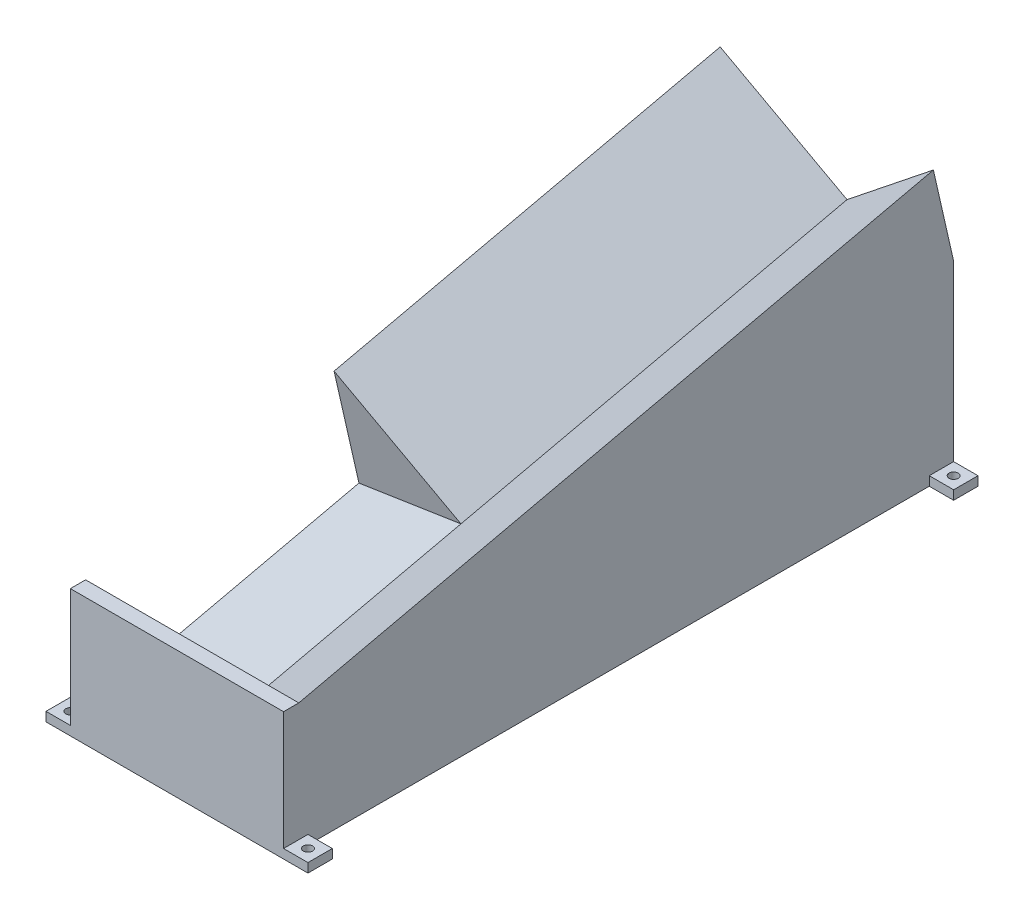
ISO-10303-21;
HEADER;
FILE_DESCRIPTION(('STEP AP214'),'2;1');
FILE_NAME('part.step','',(''),(''),'','','');
FILE_SCHEMA(('AUTOMOTIVE_DESIGN { 1 0 10303 214 1 1 1 1 }'));
ENDSEC;
DATA;
#1=APPLICATION_CONTEXT('core data for automotive mechanical design processes');
#2=APPLICATION_PROTOCOL_DEFINITION('international standard','automotive_design',2000,#1);
#3=PRODUCT_CONTEXT('',#1,'mechanical');
#4=PRODUCT('Part','Part','',(#3));
#5=PRODUCT_RELATED_PRODUCT_CATEGORY('part','',(#4));
#6=PRODUCT_DEFINITION_FORMATION('','',#4);
#7=PRODUCT_DEFINITION_CONTEXT('part definition',#1,'design');
#8=PRODUCT_DEFINITION('design','',#6,#7);
#9=PRODUCT_DEFINITION_SHAPE('','',#8);
#10=(LENGTH_UNIT() NAMED_UNIT(*) SI_UNIT(.MILLI.,.METRE.));
#11=(NAMED_UNIT(*) PLANE_ANGLE_UNIT() SI_UNIT($,.RADIAN.));
#12=(NAMED_UNIT(*) SI_UNIT($,.STERADIAN.) SOLID_ANGLE_UNIT());
#13=UNCERTAINTY_MEASURE_WITH_UNIT(LENGTH_MEASURE(1.E-05),#10,'distance_accuracy_value','');
#14=(GEOMETRIC_REPRESENTATION_CONTEXT(3) GLOBAL_UNCERTAINTY_ASSIGNED_CONTEXT((#13)) GLOBAL_UNIT_ASSIGNED_CONTEXT((#10,
#11,#12)) REPRESENTATION_CONTEXT('',''));
#15=CARTESIAN_POINT('',(0.,0.,0.));
#16=DIRECTION('',(0.,0.,1.));
#17=DIRECTION('',(1.,0.,0.));
#18=AXIS2_PLACEMENT_3D('',#15,#16,#17);
#19=CARTESIAN_POINT('',(70.,0.,0.));
#20=DIRECTION('',(1.,0.,0.));
#21=DIRECTION('',(0.,0.,-1.));
#22=AXIS2_PLACEMENT_3D('',#19,#20,#21);
#23=PLANE('',#22);
#24=DIRECTION('',(0.,1.,0.));
#25=VECTOR('',#24,1.);
#26=CARTESIAN_POINT('',(70.,0.,0.));
#27=LINE('',#26,#25);
#28=CARTESIAN_POINT('',(70.,3.,0.));
#29=VERTEX_POINT('',#28);
#30=CARTESIAN_POINT('',(70.,41.9014022891231,0.));
#31=VERTEX_POINT('',#30);
#32=EDGE_CURVE('E448',#29,#31,#27,.T.);
#33=ORIENTED_EDGE('',*,*,#32,.F.);
#34=DIRECTION('',(0.,0.,1.));
#35=VECTOR('',#34,1.);
#36=CARTESIAN_POINT('',(70.,3.,-8.));
#37=LINE('',#36,#35);
#38=CARTESIAN_POINT('',(70.,3.,-8.));
#39=VERTEX_POINT('',#38);
#40=EDGE_CURVE('E246',#39,#29,#37,.T.);
#41=ORIENTED_EDGE('',*,*,#40,.F.);
#42=DIRECTION('',(0.,-1.,0.));
#43=VECTOR('',#42,1.);
#44=CARTESIAN_POINT('',(70.,3.,-8.));
#45=LINE('',#44,#43);
#46=CARTESIAN_POINT('',(70.,0.,-8.));
#47=VERTEX_POINT('',#46);
#48=EDGE_CURVE('E227',#39,#47,#45,.T.);
#49=ORIENTED_EDGE('',*,*,#48,.T.);
#50=DIRECTION('',(0.,0.,-1.));
#51=VECTOR('',#50,1.);
#52=CARTESIAN_POINT('',(70.,0.,0.));
#53=LINE('',#52,#51);
#54=CARTESIAN_POINT('',(70.,0.,-212.));
#55=VERTEX_POINT('',#54);
#56=EDGE_CURVE('E452',#47,#55,#53,.T.);
#57=ORIENTED_EDGE('',*,*,#56,.T.);
#58=DIRECTION('',(0.,-1.,0.));
#59=VECTOR('',#58,1.);
#60=CARTESIAN_POINT('',(70.,3.,-212.));
#61=LINE('',#60,#59);
#62=CARTESIAN_POINT('',(70.,3.,-212.));
#63=VERTEX_POINT('',#62);
#64=EDGE_CURVE('E296',#63,#55,#61,.T.);
#65=ORIENTED_EDGE('',*,*,#64,.F.);
#66=DIRECTION('',(0.,0.,1.));
#67=VECTOR('',#66,1.);
#68=CARTESIAN_POINT('',(70.,3.,-220.));
#69=LINE('',#68,#67);
#70=CARTESIAN_POINT('',(70.,3.,-220.));
#71=VERTEX_POINT('',#70);
#72=EDGE_CURVE('E316',#71,#63,#69,.T.);
#73=ORIENTED_EDGE('',*,*,#72,.F.);
#74=DIRECTION('',(0.,1.,0.));
#75=VECTOR('',#74,1.);
#76=CARTESIAN_POINT('',(70.,0.,-220.));
#77=LINE('',#76,#75);
#78=CARTESIAN_POINT('',(70.,60.,-220.));
#79=VERTEX_POINT('',#78);
#80=EDGE_CURVE('E445',#71,#79,#77,.T.);
#81=ORIENTED_EDGE('',*,*,#80,.T.);
#82=DIRECTION('',(0.,0.97513285579146,0.221621103588968));
#83=VECTOR('',#82,1.);
#84=CARTESIAN_POINT('',(70.,50.4911591355599,-222.161100196464));
#85=LINE('',#84,#83);
#86=CARTESIAN_POINT('',(70.,89.2539856737438,-213.351366892331));
#87=VERTEX_POINT('',#86);
#88=EDGE_CURVE('E420',#79,#87,#85,.T.);
#89=ORIENTED_EDGE('',*,*,#88,.T.);
#90=DIRECTION('',(0.,0.221621103588968,-0.97513285579146));
#91=VECTOR('',#90,1.);
#92=CARTESIAN_POINT('',(70.,60.443242207178,-86.5840956394413));
#93=LINE('',#92,#91);
#94=CARTESIAN_POINT('',(70.,41.9014022891231,-5.00000000000002));
#95=VERTEX_POINT('',#94);
#96=EDGE_CURVE('E438',#95,#87,#93,.T.);
#97=ORIENTED_EDGE('',*,*,#96,.F.);
#98=DIRECTION('',(0.,0.,-1.));
#99=VECTOR('',#98,1.);
#100=CARTESIAN_POINT('',(70.,41.9014022891231,0.));
#101=LINE('',#100,#99);
#102=EDGE_CURVE('E379',#31,#95,#101,.T.);
#103=ORIENTED_EDGE('',*,*,#102,.F.);
#104=EDGE_LOOP('',(#33,#41,#49,#57,#65,#73,#81,#89,#97,#103));
#105=FACE_BOUND('',#104,.T.);
#106=ADVANCED_FACE('F63',(#105),#23,.T.);
#107=CARTESIAN_POINT('',(0.,0.,0.));
#108=DIRECTION('',(1.,0.,0.));
#109=DIRECTION('',(0.,0.,-1.));
#110=AXIS2_PLACEMENT_3D('',#107,#108,#109);
#111=PLANE('',#110);
#112=DIRECTION('',(0.,0.,-1.));
#113=VECTOR('',#112,1.);
#114=CARTESIAN_POINT('',(0.,3.,-7.99999999999999));
#115=LINE('',#114,#113);
#116=CARTESIAN_POINT('',(0.,3.,0.));
#117=VERTEX_POINT('',#116);
#118=CARTESIAN_POINT('',(0.,3.,-7.99999999999999));
#119=VERTEX_POINT('',#118);
#120=EDGE_CURVE('E270',#117,#119,#115,.T.);
#121=ORIENTED_EDGE('',*,*,#120,.F.);
#122=DIRECTION('',(0.,1.,0.));
#123=VECTOR('',#122,1.);
#124=CARTESIAN_POINT('',(0.,0.,0.));
#125=LINE('',#124,#123);
#126=CARTESIAN_POINT('',(0.,41.9014022891231,0.));
#127=VERTEX_POINT('',#126);
#128=EDGE_CURVE('E457',#117,#127,#125,.T.);
#129=ORIENTED_EDGE('',*,*,#128,.T.);
#130=DIRECTION('',(0.,0.,-1.));
#131=VECTOR('',#130,1.);
#132=CARTESIAN_POINT('',(0.,41.9014022891231,0.));
#133=LINE('',#132,#131);
#134=CARTESIAN_POINT('',(0.,41.9014022891231,-5.));
#135=VERTEX_POINT('',#134);
#136=EDGE_CURVE('E374',#127,#135,#133,.T.);
#137=ORIENTED_EDGE('',*,*,#136,.T.);
#138=DIRECTION('',(0.,-1.,0.));
#139=VECTOR('',#138,1.);
#140=CARTESIAN_POINT('',(0.,0.,-5.));
#141=LINE('',#140,#139);
#142=CARTESIAN_POINT('',(-3.53883589099269E-13,4.13636363636196,-5.0000000000004));
#143=VERTEX_POINT('',#142);
#144=EDGE_CURVE('E375',#135,#143,#141,.T.);
#145=ORIENTED_EDGE('',*,*,#144,.T.);
#146=DIRECTION('',(0.,-0.221621103588968,0.97513285579146));
#147=VECTOR('',#146,1.);
#148=CARTESIAN_POINT('',(0.,32.271514553641,-128.794664036036));
#149=LINE('',#148,#147);
#150=CARTESIAN_POINT('',(0.,24.5330679283227,-94.7454988846357));
#151=VERTEX_POINT('',#150);
#152=EDGE_CURVE('E396',#151,#143,#149,.T.);
#153=ORIENTED_EDGE('',*,*,#152,.F.);
#154=DIRECTION('',(0.,-0.97513285579146,-0.221621103588968));
#155=VECTOR('',#154,1.);
#156=CARTESIAN_POINT('',(0.,21.6804156689941,-95.393828943574));
#157=LINE('',#156,#155);
#158=CARTESIAN_POINT('',(0.,60.443242207178,-86.5840956394413));
#159=VERTEX_POINT('',#158);
#160=EDGE_CURVE('E421',#159,#151,#157,.T.);
#161=ORIENTED_EDGE('',*,*,#160,.F.);
#162=DIRECTION('',(0.,0.221621103588968,-0.97513285579146));
#163=VECTOR('',#162,1.);
#164=CARTESIAN_POINT('',(0.,60.443242207178,-86.5840956394413));
#165=LINE('',#164,#163);
#166=CARTESIAN_POINT('',(0.,89.2539856737438,-213.351366892331));
#167=VERTEX_POINT('',#166);
#168=EDGE_CURVE('E407',#159,#167,#165,.T.);
#169=ORIENTED_EDGE('',*,*,#168,.T.);
#170=DIRECTION('',(0.,-0.97513285579146,-0.221621103588968));
#171=VECTOR('',#170,1.);
#172=CARTESIAN_POINT('',(0.,50.4911591355599,-222.161100196464));
#173=LINE('',#172,#171);
#174=CARTESIAN_POINT('',(0.,60.,-220.));
#175=VERTEX_POINT('',#174);
#176=EDGE_CURVE('E412',#167,#175,#173,.T.);
#177=ORIENTED_EDGE('',*,*,#176,.T.);
#178=DIRECTION('',(0.,1.,0.));
#179=VECTOR('',#178,1.);
#180=CARTESIAN_POINT('',(0.,0.,-220.));
#181=LINE('',#180,#179);
#182=CARTESIAN_POINT('',(0.,3.,-220.));
#183=VERTEX_POINT('',#182);
#184=EDGE_CURVE('E441',#183,#175,#181,.T.);
#185=ORIENTED_EDGE('',*,*,#184,.F.);
#186=DIRECTION('',(0.,0.,-1.));
#187=VECTOR('',#186,1.);
#188=CARTESIAN_POINT('',(0.,3.,-220.));
#189=LINE('',#188,#187);
#190=CARTESIAN_POINT('',(0.,3.,-212.));
#191=VERTEX_POINT('',#190);
#192=EDGE_CURVE('E343',#191,#183,#189,.T.);
#193=ORIENTED_EDGE('',*,*,#192,.F.);
#194=DIRECTION('',(0.,-1.,0.));
#195=VECTOR('',#194,1.);
#196=CARTESIAN_POINT('',(0.,3.,-212.));
#197=LINE('',#196,#195);
#198=CARTESIAN_POINT('',(0.,0.,-212.));
#199=VERTEX_POINT('',#198);
#200=EDGE_CURVE('E357',#191,#199,#197,.T.);
#201=ORIENTED_EDGE('',*,*,#200,.T.);
#202=DIRECTION('',(0.,0.,-1.));
#203=VECTOR('',#202,1.);
#204=CARTESIAN_POINT('',(0.,0.,0.));
#205=LINE('',#204,#203);
#206=CARTESIAN_POINT('',(0.,0.,-7.99999999999999));
#207=VERTEX_POINT('',#206);
#208=EDGE_CURVE('E449',#207,#199,#205,.T.);
#209=ORIENTED_EDGE('',*,*,#208,.F.);
#210=DIRECTION('',(0.,-1.,0.));
#211=VECTOR('',#210,1.);
#212=CARTESIAN_POINT('',(0.,3.,-7.99999999999999));
#213=LINE('',#212,#211);
#214=EDGE_CURVE('E87',#119,#207,#213,.T.);
#215=ORIENTED_EDGE('',*,*,#214,.F.);
#216=EDGE_LOOP('',(#121,#129,#137,#145,#153,#161,#169,#177,#185,#193,#201,#209,#215));
#217=FACE_BOUND('',#216,.T.);
#218=ADVANCED_FACE('F485',(#217),#111,.F.);
#219=CARTESIAN_POINT('',(10.0052258890304,10.2979204259837,-97.9807596806218));
#220=DIRECTION('',(0.650791373455968,-0.740376058942992,-0.168267286123407));
#221=DIRECTION('',(0.751085481533816,0.660204967740409,0.));
#222=AXIS2_PLACEMENT_3D('',#219,#220,#221);
#223=PLANE('',#222);
#224=DIRECTION('',(0.,0.221621103588968,-0.97513285579146));
#225=VECTOR('',#224,1.);
#226=CARTESIAN_POINT('',(35.,10.1352516924822,-0.59510744692165));
#227=LINE('',#226,#225);
#228=CARTESIAN_POINT('',(35.,11.1363636363638,-5.00000000000001));
#229=VERTEX_POINT('',#228);
#230=CARTESIAN_POINT('',(35.,31.1892565334342,-93.2327287471104));
#231=VERTEX_POINT('',#230);
#232=EDGE_CURVE('E401',#229,#231,#227,.T.);
#233=ORIENTED_EDGE('',*,*,#232,.F.);
#234=DIRECTION('',(0.751085481533816,0.66020496774041,0.));
#235=VECTOR('',#234,1.);
#236=CARTESIAN_POINT('',(20.4839539216836,-1.62325689748328,-5.));
#237=LINE('',#236,#235);
#238=EDGE_CURVE('E393',#229,#95,#237,.T.);
#239=ORIENTED_EDGE('',*,*,#238,.T.);
#240=ORIENTED_EDGE('',*,*,#96,.T.);
#241=DIRECTION('',(-0.759256602365297,-0.634608050522565,-0.144229102391492));
#242=VECTOR('',#241,1.);
#243=CARTESIAN_POINT('',(10.0052258890304,39.1086638925496,-224.748030933512));
#244=LINE('',#243,#242);
#245=CARTESIAN_POINT('',(35.,60.,-220.));
#246=VERTEX_POINT('',#245);
#247=EDGE_CURVE('E433',#87,#246,#244,.T.);
#248=ORIENTED_EDGE('',*,*,#247,.T.);
#249=DIRECTION('',(0.,0.221621103588968,-0.97513285579146));
#250=VECTOR('',#249,1.);
#251=CARTESIAN_POINT('',(35.,31.1892565334342,-93.2327287471104));
#252=LINE('',#251,#250);
#253=EDGE_CURVE('E437',#231,#246,#252,.T.);
#254=ORIENTED_EDGE('',*,*,#253,.F.);
#255=EDGE_LOOP('',(#233,#239,#240,#248,#254));
#256=FACE_BOUND('',#255,.T.);
#257=ADVANCED_FACE('F494',(#256),#223,.F.);
#258=CARTESIAN_POINT('',(70.,0.,-220.));
#259=DIRECTION('',(0.,0.,1.));
#260=DIRECTION('',(1.,0.,0.));
#261=AXIS2_PLACEMENT_3D('',#258,#259,#260);
#262=PLANE('',#261);
#263=DIRECTION('',(-1.,0.,0.));
#264=VECTOR('',#263,1.);
#265=CARTESIAN_POINT('',(70.,0.,-220.));
#266=LINE('',#265,#264);
#267=CARTESIAN_POINT('',(78.,0.,-220.));
#268=VERTEX_POINT('',#267);
#269=CARTESIAN_POINT('',(-8.,0.,-220.));
#270=VERTEX_POINT('',#269);
#271=EDGE_CURVE('E217',#268,#270,#266,.T.);
#272=ORIENTED_EDGE('',*,*,#271,.T.);
#273=DIRECTION('',(0.,-1.,0.));
#274=VECTOR('',#273,1.);
#275=CARTESIAN_POINT('',(-8.,3.,-220.));
#276=LINE('',#275,#274);
#277=CARTESIAN_POINT('',(-8.,3.,-220.));
#278=VERTEX_POINT('',#277);
#279=EDGE_CURVE('E370',#278,#270,#276,.T.);
#280=ORIENTED_EDGE('',*,*,#279,.F.);
#281=DIRECTION('',(-1.,0.,0.));
#282=VECTOR('',#281,1.);
#283=CARTESIAN_POINT('',(0.,3.,-220.));
#284=LINE('',#283,#282);
#285=EDGE_CURVE('E347',#183,#278,#284,.T.);
#286=ORIENTED_EDGE('',*,*,#285,.F.);
#287=ORIENTED_EDGE('',*,*,#184,.T.);
#288=DIRECTION('',(-1.,0.,0.));
#289=VECTOR('',#288,1.);
#290=CARTESIAN_POINT('',(0.,60.,-220.));
#291=LINE('',#290,#289);
#292=EDGE_CURVE('E416',#246,#175,#291,.T.);
#293=ORIENTED_EDGE('',*,*,#292,.F.);
#294=DIRECTION('',(-1.,0.,0.));
#295=VECTOR('',#294,1.);
#296=CARTESIAN_POINT('',(70.,60.,-220.));
#297=LINE('',#296,#295);
#298=EDGE_CURVE('E72',#79,#246,#297,.T.);
#299=ORIENTED_EDGE('',*,*,#298,.F.);
#300=ORIENTED_EDGE('',*,*,#80,.F.);
#301=DIRECTION('',(-1.,0.,0.));
#302=VECTOR('',#301,1.);
#303=CARTESIAN_POINT('',(78.,3.,-220.));
#304=LINE('',#303,#302);
#305=CARTESIAN_POINT('',(78.,3.,-220.));
#306=VERTEX_POINT('',#305);
#307=EDGE_CURVE('E320',#306,#71,#304,.T.);
#308=ORIENTED_EDGE('',*,*,#307,.F.);
#309=DIRECTION('',(0.,-1.,0.));
#310=VECTOR('',#309,1.);
#311=CARTESIAN_POINT('',(78.,3.,-220.));
#312=LINE('',#311,#310);
#313=EDGE_CURVE('E289',#306,#268,#312,.T.);
#314=ORIENTED_EDGE('',*,*,#313,.T.);
#315=EDGE_LOOP('',(#272,#280,#286,#287,#293,#299,#300,#308,#314));
#316=FACE_BOUND('',#315,.T.);
#317=ADVANCED_FACE('F65',(#316),#262,.F.);
#318=CARTESIAN_POINT('',(70.,0.,0.));
#319=DIRECTION('',(0.,0.,1.));
#320=DIRECTION('',(1.,0.,0.));
#321=AXIS2_PLACEMENT_3D('',#318,#319,#320);
#322=PLANE('',#321);
#323=DIRECTION('',(-1.,0.,0.));
#324=VECTOR('',#323,1.);
#325=CARTESIAN_POINT('',(70.,0.,0.));
#326=LINE('',#325,#324);
#327=CARTESIAN_POINT('',(78.,0.,0.));
#328=VERTEX_POINT('',#327);
#329=CARTESIAN_POINT('',(-8.,0.,0.));
#330=VERTEX_POINT('',#329);
#331=EDGE_CURVE('E204',#328,#330,#326,.T.);
#332=ORIENTED_EDGE('',*,*,#331,.F.);
#333=DIRECTION('',(0.,-1.,0.));
#334=VECTOR('',#333,1.);
#335=CARTESIAN_POINT('',(78.,3.,0.));
#336=LINE('',#335,#334);
#337=CARTESIAN_POINT('',(78.,3.,0.));
#338=VERTEX_POINT('',#337);
#339=EDGE_CURVE('E207',#338,#328,#336,.T.);
#340=ORIENTED_EDGE('',*,*,#339,.F.);
#341=DIRECTION('',(1.,0.,0.));
#342=VECTOR('',#341,1.);
#343=CARTESIAN_POINT('',(78.,3.,0.));
#344=LINE('',#343,#342);
#345=EDGE_CURVE('E79',#29,#338,#344,.T.);
#346=ORIENTED_EDGE('',*,*,#345,.F.);
#347=ORIENTED_EDGE('',*,*,#32,.T.);
#348=DIRECTION('',(-1.,0.,0.));
#349=VECTOR('',#348,1.);
#350=CARTESIAN_POINT('',(112.198667204012,41.9014022891231,0.));
#351=LINE('',#350,#349);
#352=EDGE_CURVE('E389',#31,#127,#351,.T.);
#353=ORIENTED_EDGE('',*,*,#352,.T.);
#354=ORIENTED_EDGE('',*,*,#128,.F.);
#355=DIRECTION('',(1.,0.,0.));
#356=VECTOR('',#355,1.);
#357=CARTESIAN_POINT('',(0.,3.,0.));
#358=LINE('',#357,#356);
#359=CARTESIAN_POINT('',(-8.,3.,0.));
#360=VERTEX_POINT('',#359);
#361=EDGE_CURVE('E265',#360,#117,#358,.T.);
#362=ORIENTED_EDGE('',*,*,#361,.F.);
#363=DIRECTION('',(0.,-1.,0.));
#364=VECTOR('',#363,1.);
#365=CARTESIAN_POINT('',(-8.,3.,0.));
#366=LINE('',#365,#364);
#367=EDGE_CURVE('E211',#360,#330,#366,.T.);
#368=ORIENTED_EDGE('',*,*,#367,.T.);
#369=EDGE_LOOP('',(#332,#340,#346,#347,#353,#354,#362,#368));
#370=FACE_BOUND('',#369,.T.);
#371=ADVANCED_FACE('F206',(#370),#322,.T.);
#372=CARTESIAN_POINT('',(70.,0.,0.));
#373=DIRECTION('',(0.,1.,0.));
#374=DIRECTION('',(0.,0.,1.));
#375=AXIS2_PLACEMENT_3D('',#372,#373,#374);
#376=PLANE('',#375);
#377=ORIENTED_EDGE('',*,*,#271,.F.);
#378=DIRECTION('',(0.,0.,-1.));
#379=VECTOR('',#378,1.);
#380=CARTESIAN_POINT('',(78.,0.,-220.));
#381=LINE('',#380,#379);
#382=CARTESIAN_POINT('',(78.,0.,-212.));
#383=VERTEX_POINT('',#382);
#384=EDGE_CURVE('E308',#383,#268,#381,.T.);
#385=ORIENTED_EDGE('',*,*,#384,.F.);
#386=DIRECTION('',(1.,0.,0.));
#387=VECTOR('',#386,1.);
#388=CARTESIAN_POINT('',(78.,0.,-212.));
#389=LINE('',#388,#387);
#390=EDGE_CURVE('E305',#55,#383,#389,.T.);
#391=ORIENTED_EDGE('',*,*,#390,.F.);
#392=ORIENTED_EDGE('',*,*,#56,.F.);
#393=DIRECTION('',(-1.,0.,0.));
#394=VECTOR('',#393,1.);
#395=CARTESIAN_POINT('',(78.,0.,-8.00000000000001));
#396=LINE('',#395,#394);
#397=CARTESIAN_POINT('',(78.,0.,-8.00000000000001));
#398=VERTEX_POINT('',#397);
#399=EDGE_CURVE('E232',#398,#47,#396,.T.);
#400=ORIENTED_EDGE('',*,*,#399,.F.);
#401=DIRECTION('',(0.,0.,-1.));
#402=VECTOR('',#401,1.);
#403=CARTESIAN_POINT('',(78.,0.,-8.00000000000001));
#404=LINE('',#403,#402);
#405=EDGE_CURVE('E223',#328,#398,#404,.T.);
#406=ORIENTED_EDGE('',*,*,#405,.F.);
#407=ORIENTED_EDGE('',*,*,#331,.T.);
#408=DIRECTION('',(0.,0.,1.));
#409=VECTOR('',#408,1.);
#410=CARTESIAN_POINT('',(-8.,0.,-7.99999999999999));
#411=LINE('',#410,#409);
#412=CARTESIAN_POINT('',(-8.,0.,-7.99999999999999));
#413=VERTEX_POINT('',#412);
#414=EDGE_CURVE('E266',#413,#330,#411,.T.);
#415=ORIENTED_EDGE('',*,*,#414,.F.);
#416=DIRECTION('',(-1.,0.,0.));
#417=VECTOR('',#416,1.);
#418=CARTESIAN_POINT('',(0.,0.,-7.99999999999999));
#419=LINE('',#418,#417);
#420=EDGE_CURVE('E269',#207,#413,#419,.T.);
#421=ORIENTED_EDGE('',*,*,#420,.F.);
#422=ORIENTED_EDGE('',*,*,#208,.T.);
#423=DIRECTION('',(1.,0.,0.));
#424=VECTOR('',#423,1.);
#425=CARTESIAN_POINT('',(0.,0.,-212.));
#426=LINE('',#425,#424);
#427=CARTESIAN_POINT('',(-8.,0.,-212.));
#428=VERTEX_POINT('',#427);
#429=EDGE_CURVE('E348',#428,#199,#426,.T.);
#430=ORIENTED_EDGE('',*,*,#429,.F.);
#431=DIRECTION('',(0.,0.,1.));
#432=VECTOR('',#431,1.);
#433=CARTESIAN_POINT('',(-8.,0.,-220.));
#434=LINE('',#433,#432);
#435=EDGE_CURVE('E339',#270,#428,#434,.T.);
#436=ORIENTED_EDGE('',*,*,#435,.F.);
#437=EDGE_LOOP('',(#377,#385,#391,#392,#400,#406,#407,#415,#421,#422,#430,#436));
#438=FACE_BOUND('',#437,.T.);
#439=CARTESIAN_POINT('',(-4.,0.,-216.));
#440=DIRECTION('',(0.,1.,0.));
#441=DIRECTION('',(0.,0.,1.));
#442=AXIS2_PLACEMENT_3D('',#439,#440,#441);
#443=CIRCLE('',#442,1.5);
#444=CARTESIAN_POINT('',(-4.,0.,-214.5));
#445=VERTEX_POINT('',#444);
#446=EDGE_CURVE('E331',#445,#445,#443,.T.);
#447=ORIENTED_EDGE('',*,*,#446,.T.);
#448=EDGE_LOOP('',(#447));
#449=FACE_BOUND('',#448,.T.);
#450=CARTESIAN_POINT('',(74.,0.,-216.));
#451=DIRECTION('',(0.,1.,0.));
#452=DIRECTION('',(0.,0.,1.));
#453=AXIS2_PLACEMENT_3D('',#450,#451,#452);
#454=CIRCLE('',#453,1.5);
#455=CARTESIAN_POINT('',(74.,0.,-214.5));
#456=VERTEX_POINT('',#455);
#457=EDGE_CURVE('E327',#456,#456,#454,.T.);
#458=ORIENTED_EDGE('',*,*,#457,.T.);
#459=EDGE_LOOP('',(#458));
#460=FACE_BOUND('',#459,.T.);
#461=CARTESIAN_POINT('',(-4.,0.,-3.99999999999999));
#462=DIRECTION('',(0.,1.,0.));
#463=DIRECTION('',(0.,0.,1.));
#464=AXIS2_PLACEMENT_3D('',#461,#462,#463);
#465=CIRCLE('',#464,1.5);
#466=CARTESIAN_POINT('',(-4.,0.,-2.49999999999999));
#467=VERTEX_POINT('',#466);
#468=EDGE_CURVE('E285',#467,#467,#465,.T.);
#469=ORIENTED_EDGE('',*,*,#468,.T.);
#470=EDGE_LOOP('',(#469));
#471=FACE_BOUND('',#470,.T.);
#472=CARTESIAN_POINT('',(74.,0.,-4.));
#473=DIRECTION('',(0.,1.,0.));
#474=DIRECTION('',(0.,0.,1.));
#475=AXIS2_PLACEMENT_3D('',#472,#473,#474);
#476=CIRCLE('',#475,1.5);
#477=CARTESIAN_POINT('',(74.,0.,-2.5));
#478=VERTEX_POINT('',#477);
#479=EDGE_CURVE('E240',#478,#478,#476,.T.);
#480=ORIENTED_EDGE('',*,*,#479,.T.);
#481=EDGE_LOOP('',(#480));
#482=FACE_BOUND('',#481,.T.);
#483=ADVANCED_FACE('F229',(#438,#449,#460,#471,#482),#376,.F.);
#484=CARTESIAN_POINT('',(0.,50.4911591355599,-222.161100196464));
#485=DIRECTION('',(0.,0.221621103588968,-0.97513285579146));
#486=DIRECTION('',(0.,0.97513285579146,0.221621103588968));
#487=AXIS2_PLACEMENT_3D('',#484,#485,#486);
#488=PLANE('',#487);
#489=ORIENTED_EDGE('',*,*,#88,.F.);
#490=ORIENTED_EDGE('',*,*,#298,.T.);
#491=ORIENTED_EDGE('',*,*,#247,.F.);
#492=EDGE_LOOP('',(#489,#490,#491));
#493=FACE_BOUND('',#492,.T.);
#494=ADVANCED_FACE('F469',(#493),#488,.T.);
#495=CARTESIAN_POINT('',(19.641832934499,44.0260450851236,-90.3152768035446));
#496=DIRECTION('',(-0.650791373455968,-0.740376058942993,-0.168267286123407));
#497=DIRECTION('',(0.751085481533816,-0.660204967740409,0.));
#498=AXIS2_PLACEMENT_3D('',#495,#496,#497);
#499=PLANE('',#498);
#500=DIRECTION('',(-0.759256602365297,0.634608050522565,0.144229102391492));
#501=VECTOR('',#500,1.);
#502=CARTESIAN_POINT('',(19.641832934499,72.8367885516895,-217.082548056434));
#503=LINE('',#502,#501);
#504=EDGE_CURVE('E406',#246,#167,#503,.T.);
#505=ORIENTED_EDGE('',*,*,#504,.T.);
#506=ORIENTED_EDGE('',*,*,#168,.F.);
#507=DIRECTION('',(-0.759256602365297,0.634608050522565,0.144229102391492));
#508=VECTOR('',#507,1.);
#509=CARTESIAN_POINT('',(19.641832934499,44.0260450851236,-90.3152768035446));
#510=LINE('',#509,#508);
#511=EDGE_CURVE('E411',#231,#159,#510,.T.);
#512=ORIENTED_EDGE('',*,*,#511,.F.);
#513=ORIENTED_EDGE('',*,*,#253,.T.);
#514=EDGE_LOOP('',(#505,#506,#512,#513));
#515=FACE_BOUND('',#514,.T.);
#516=ADVANCED_FACE('F476',(#515),#499,.F.);
#517=CARTESIAN_POINT('',(0.,21.6804156689941,-95.393828943574));
#518=DIRECTION('',(0.,0.221621103588968,-0.97513285579146));
#519=DIRECTION('',(0.,0.97513285579146,0.221621103588968));
#520=AXIS2_PLACEMENT_3D('',#517,#518,#519);
#521=PLANE('',#520);
#522=ORIENTED_EDGE('',*,*,#511,.T.);
#523=ORIENTED_EDGE('',*,*,#160,.T.);
#524=DIRECTION('',(0.981508184530059,0.186660102676837,0.0424227506083718));
#525=VECTOR('',#524,1.);
#526=CARTESIAN_POINT('',(66.7307692307692,37.2237132358675,-91.8612613147392));
#527=LINE('',#526,#525);
#528=EDGE_CURVE('E397',#151,#231,#527,.T.);
#529=ORIENTED_EDGE('',*,*,#528,.T.);
#530=EDGE_LOOP('',(#522,#523,#529));
#531=FACE_BOUND('',#530,.T.);
#532=ADVANCED_FACE('F489',(#531),#521,.F.);
#533=CARTESIAN_POINT('',(0.,50.4911591355599,-222.161100196464));
#534=DIRECTION('',(0.,0.221621103588968,-0.97513285579146));
#535=DIRECTION('',(0.,0.97513285579146,0.221621103588968));
#536=AXIS2_PLACEMENT_3D('',#533,#534,#535);
#537=PLANE('',#536);
#538=ORIENTED_EDGE('',*,*,#504,.F.);
#539=ORIENTED_EDGE('',*,*,#292,.T.);
#540=ORIENTED_EDGE('',*,*,#176,.F.);
#541=EDGE_LOOP('',(#538,#539,#540));
#542=FACE_BOUND('',#541,.T.);
#543=ADVANCED_FACE('F481',(#542),#537,.T.);
#544=CARTESIAN_POINT('',(66.7307692307692,45.6176683997987,-128.794664036036));
#545=DIRECTION('',(0.191420175792698,-0.957100878963488,-0.217522927037156));
#546=DIRECTION('',(0.,0.221621103588968,-0.97513285579146));
#547=AXIS2_PLACEMENT_3D('',#544,#545,#546);
#548=PLANE('',#547);
#549=ORIENTED_EDGE('',*,*,#152,.T.);
#550=DIRECTION('',(0.98058067569092,0.196116135138184,0.));
#551=VECTOR('',#550,1.);
#552=CARTESIAN_POINT('',(72.1413751764001,18.5646386716439,-4.99999999999999));
#553=LINE('',#552,#551);
#554=EDGE_CURVE('E12',#143,#229,#553,.T.);
#555=ORIENTED_EDGE('',*,*,#554,.T.);
#556=ORIENTED_EDGE('',*,*,#232,.T.);
#557=ORIENTED_EDGE('',*,*,#528,.F.);
#558=EDGE_LOOP('',(#549,#555,#556,#557));
#559=FACE_BOUND('',#558,.T.);
#560=ADVANCED_FACE('F491',(#559),#548,.F.);
#561=CARTESIAN_POINT('',(112.198667204012,0.,-5.));
#562=DIRECTION('',(0.,0.,-1.));
#563=DIRECTION('',(0.,1.,0.));
#564=AXIS2_PLACEMENT_3D('',#561,#562,#563);
#565=PLANE('',#564);
#566=ORIENTED_EDGE('',*,*,#238,.F.);
#567=ORIENTED_EDGE('',*,*,#554,.F.);
#568=ORIENTED_EDGE('',*,*,#144,.F.);
#569=DIRECTION('',(-1.,0.,0.));
#570=VECTOR('',#569,1.);
#571=CARTESIAN_POINT('',(112.198667204012,41.9014022891231,-5.));
#572=LINE('',#571,#570);
#573=EDGE_CURVE('E386',#95,#135,#572,.T.);
#574=ORIENTED_EDGE('',*,*,#573,.F.);
#575=EDGE_LOOP('',(#566,#567,#568,#574));
#576=FACE_BOUND('',#575,.T.);
#577=ADVANCED_FACE('F498',(#576),#565,.T.);
#578=CARTESIAN_POINT('',(112.198667204012,41.9014022891231,0.));
#579=DIRECTION('',(0.,1.,0.));
#580=DIRECTION('',(0.,0.,1.));
#581=AXIS2_PLACEMENT_3D('',#578,#579,#580);
#582=PLANE('',#581);
#583=ORIENTED_EDGE('',*,*,#352,.F.);
#584=ORIENTED_EDGE('',*,*,#102,.T.);
#585=ORIENTED_EDGE('',*,*,#573,.T.);
#586=ORIENTED_EDGE('',*,*,#136,.F.);
#587=EDGE_LOOP('',(#583,#584,#585,#586));
#588=FACE_BOUND('',#587,.T.);
#589=ADVANCED_FACE('F504',(#588),#582,.T.);
#590=CARTESIAN_POINT('',(0.,3.,0.));
#591=DIRECTION('',(0.,-1.,0.));
#592=DIRECTION('',(0.,0.,-1.));
#593=AXIS2_PLACEMENT_3D('',#590,#591,#592);
#594=PLANE('',#593);
#595=ORIENTED_EDGE('',*,*,#192,.T.);
#596=ORIENTED_EDGE('',*,*,#285,.T.);
#597=DIRECTION('',(0.,0.,1.));
#598=VECTOR('',#597,1.);
#599=CARTESIAN_POINT('',(-8.,3.,-220.));
#600=LINE('',#599,#598);
#601=CARTESIAN_POINT('',(-8.,3.,-212.));
#602=VERTEX_POINT('',#601);
#603=EDGE_CURVE('E351',#278,#602,#600,.T.);
#604=ORIENTED_EDGE('',*,*,#603,.T.);
#605=DIRECTION('',(1.,0.,0.));
#606=VECTOR('',#605,1.);
#607=CARTESIAN_POINT('',(0.,3.,-212.));
#608=LINE('',#607,#606);
#609=EDGE_CURVE('E354',#602,#191,#608,.T.);
#610=ORIENTED_EDGE('',*,*,#609,.T.);
#611=EDGE_LOOP('',(#595,#596,#604,#610));
#612=FACE_BOUND('',#611,.T.);
#613=CARTESIAN_POINT('',(-4.,3.,-216.));
#614=DIRECTION('',(0.,1.,0.));
#615=DIRECTION('',(0.,0.,1.));
#616=AXIS2_PLACEMENT_3D('',#613,#614,#615);
#617=CIRCLE('',#616,1.5);
#618=CARTESIAN_POINT('',(-4.,3.,-214.5));
#619=VERTEX_POINT('',#618);
#620=EDGE_CURVE('E335',#619,#619,#617,.T.);
#621=ORIENTED_EDGE('',*,*,#620,.F.);
#622=EDGE_LOOP('',(#621));
#623=FACE_BOUND('',#622,.T.);
#624=ADVANCED_FACE('F532',(#612,#623),#594,.F.);
#625=CARTESIAN_POINT('',(-8.,3.,-220.));
#626=DIRECTION('',(1.,0.,0.));
#627=DIRECTION('',(0.,0.,-1.));
#628=AXIS2_PLACEMENT_3D('',#625,#626,#627);
#629=PLANE('',#628);
#630=ORIENTED_EDGE('',*,*,#435,.T.);
#631=DIRECTION('',(0.,-1.,0.));
#632=VECTOR('',#631,1.);
#633=CARTESIAN_POINT('',(-8.,3.,-212.));
#634=LINE('',#633,#632);
#635=EDGE_CURVE('E366',#602,#428,#634,.T.);
#636=ORIENTED_EDGE('',*,*,#635,.F.);
#637=ORIENTED_EDGE('',*,*,#603,.F.);
#638=ORIENTED_EDGE('',*,*,#279,.T.);
#639=EDGE_LOOP('',(#630,#636,#637,#638));
#640=FACE_BOUND('',#639,.T.);
#641=ADVANCED_FACE('F522',(#640),#629,.F.);
#642=CARTESIAN_POINT('',(0.,3.,-212.));
#643=DIRECTION('',(0.,0.,-1.));
#644=DIRECTION('',(-1.,0.,0.));
#645=AXIS2_PLACEMENT_3D('',#642,#643,#644);
#646=PLANE('',#645);
#647=ORIENTED_EDGE('',*,*,#429,.T.);
#648=ORIENTED_EDGE('',*,*,#200,.F.);
#649=ORIENTED_EDGE('',*,*,#609,.F.);
#650=ORIENTED_EDGE('',*,*,#635,.T.);
#651=EDGE_LOOP('',(#647,#648,#649,#650));
#652=FACE_BOUND('',#651,.T.);
#653=ADVANCED_FACE('F528',(#652),#646,.F.);
#654=CARTESIAN_POINT('',(-4.,3.,-216.));
#655=DIRECTION('',(0.,-1.,0.));
#656=DIRECTION('',(0.,0.,-1.));
#657=AXIS2_PLACEMENT_3D('',#654,#655,#656);
#658=CYLINDRICAL_SURFACE('',#657,1.5);
#659=ORIENTED_EDGE('',*,*,#620,.T.);
#660=EDGE_LOOP('',(#659));
#661=FACE_BOUND('',#660,.T.);
#662=ORIENTED_EDGE('',*,*,#446,.F.);
#663=EDGE_LOOP('',(#662));
#664=FACE_BOUND('',#663,.T.);
#665=ADVANCED_FACE('F538',(#661,#664),#658,.F.);
#666=CARTESIAN_POINT('',(0.,3.,0.));
#667=DIRECTION('',(0.,-1.,0.));
#668=DIRECTION('',(0.,0.,-1.));
#669=AXIS2_PLACEMENT_3D('',#666,#667,#668);
#670=PLANE('',#669);
#671=DIRECTION('',(0.,0.,-1.));
#672=VECTOR('',#671,1.);
#673=CARTESIAN_POINT('',(78.,3.,-220.));
#674=LINE('',#673,#672);
#675=CARTESIAN_POINT('',(78.,3.,-212.));
#676=VERTEX_POINT('',#675);
#677=EDGE_CURVE('E309',#676,#306,#674,.T.);
#678=ORIENTED_EDGE('',*,*,#677,.T.);
#679=ORIENTED_EDGE('',*,*,#307,.T.);
#680=ORIENTED_EDGE('',*,*,#72,.T.);
#681=DIRECTION('',(1.,0.,0.));
#682=VECTOR('',#681,1.);
#683=CARTESIAN_POINT('',(78.,3.,-212.));
#684=LINE('',#683,#682);
#685=EDGE_CURVE('E304',#63,#676,#684,.T.);
#686=ORIENTED_EDGE('',*,*,#685,.T.);
#687=EDGE_LOOP('',(#678,#679,#680,#686));
#688=FACE_BOUND('',#687,.T.);
#689=CARTESIAN_POINT('',(74.,3.,-216.));
#690=DIRECTION('',(0.,1.,0.));
#691=DIRECTION('',(0.,0.,1.));
#692=AXIS2_PLACEMENT_3D('',#689,#690,#691);
#693=CIRCLE('',#692,1.5);
#694=CARTESIAN_POINT('',(74.,3.,-214.5));
#695=VERTEX_POINT('',#694);
#696=EDGE_CURVE('E313',#695,#695,#693,.T.);
#697=ORIENTED_EDGE('',*,*,#696,.F.);
#698=EDGE_LOOP('',(#697));
#699=FACE_BOUND('',#698,.T.);
#700=ADVANCED_FACE('F509',(#688,#699),#670,.F.);
#701=CARTESIAN_POINT('',(78.,3.,-220.));
#702=DIRECTION('',(-1.,0.,0.));
#703=DIRECTION('',(0.,0.,1.));
#704=AXIS2_PLACEMENT_3D('',#701,#702,#703);
#705=PLANE('',#704);
#706=ORIENTED_EDGE('',*,*,#384,.T.);
#707=ORIENTED_EDGE('',*,*,#313,.F.);
#708=ORIENTED_EDGE('',*,*,#677,.F.);
#709=DIRECTION('',(0.,-1.,0.));
#710=VECTOR('',#709,1.);
#711=CARTESIAN_POINT('',(78.,3.,-212.));
#712=LINE('',#711,#710);
#713=EDGE_CURVE('E300',#676,#383,#712,.T.);
#714=ORIENTED_EDGE('',*,*,#713,.T.);
#715=EDGE_LOOP('',(#706,#707,#708,#714));
#716=FACE_BOUND('',#715,.T.);
#717=ADVANCED_FACE('F516',(#716),#705,.F.);
#718=CARTESIAN_POINT('',(78.,3.,-212.));
#719=DIRECTION('',(0.,0.,-1.));
#720=DIRECTION('',(-1.,0.,0.));
#721=AXIS2_PLACEMENT_3D('',#718,#719,#720);
#722=PLANE('',#721);
#723=ORIENTED_EDGE('',*,*,#390,.T.);
#724=ORIENTED_EDGE('',*,*,#713,.F.);
#725=ORIENTED_EDGE('',*,*,#685,.F.);
#726=ORIENTED_EDGE('',*,*,#64,.T.);
#727=EDGE_LOOP('',(#723,#724,#725,#726));
#728=FACE_BOUND('',#727,.T.);
#729=ADVANCED_FACE('F740',(#728),#722,.F.);
#730=CARTESIAN_POINT('',(74.,3.,-216.));
#731=DIRECTION('',(0.,-1.,0.));
#732=DIRECTION('',(0.,0.,-1.));
#733=AXIS2_PLACEMENT_3D('',#730,#731,#732);
#734=CYLINDRICAL_SURFACE('',#733,1.5);
#735=ORIENTED_EDGE('',*,*,#696,.T.);
#736=EDGE_LOOP('',(#735));
#737=FACE_BOUND('',#736,.T.);
#738=ORIENTED_EDGE('',*,*,#457,.F.);
#739=EDGE_LOOP('',(#738));
#740=FACE_BOUND('',#739,.T.);
#741=ADVANCED_FACE('F750',(#737,#740),#734,.F.);
#742=CARTESIAN_POINT('',(0.,3.,0.));
#743=DIRECTION('',(0.,-1.,0.));
#744=DIRECTION('',(0.,0.,-1.));
#745=AXIS2_PLACEMENT_3D('',#742,#743,#744);
#746=PLANE('',#745);
#747=ORIENTED_EDGE('',*,*,#120,.T.);
#748=DIRECTION('',(-1.,0.,0.));
#749=VECTOR('',#748,1.);
#750=CARTESIAN_POINT('',(0.,3.,-7.99999999999999));
#751=LINE('',#750,#749);
#752=CARTESIAN_POINT('',(-8.,3.,-7.99999999999999));
#753=VERTEX_POINT('',#752);
#754=EDGE_CURVE('E279',#119,#753,#751,.T.);
#755=ORIENTED_EDGE('',*,*,#754,.T.);
#756=DIRECTION('',(0.,0.,1.));
#757=VECTOR('',#756,1.);
#758=CARTESIAN_POINT('',(-8.,3.,-7.99999999999999));
#759=LINE('',#758,#757);
#760=EDGE_CURVE('E276',#753,#360,#759,.T.);
#761=ORIENTED_EDGE('',*,*,#760,.T.);
#762=ORIENTED_EDGE('',*,*,#361,.T.);
#763=EDGE_LOOP('',(#747,#755,#761,#762));
#764=FACE_BOUND('',#763,.T.);
#765=CARTESIAN_POINT('',(-4.,3.,-3.99999999999999));
#766=DIRECTION('',(0.,1.,0.));
#767=DIRECTION('',(0.,0.,1.));
#768=AXIS2_PLACEMENT_3D('',#765,#766,#767);
#769=CIRCLE('',#768,1.5);
#770=CARTESIAN_POINT('',(-4.,3.,-2.49999999999999));
#771=VERTEX_POINT('',#770);
#772=EDGE_CURVE('E273',#771,#771,#769,.T.);
#773=ORIENTED_EDGE('',*,*,#772,.F.);
#774=EDGE_LOOP('',(#773));
#775=FACE_BOUND('',#774,.T.);
#776=ADVANCED_FACE('F761',(#764,#775),#746,.F.);
#777=CARTESIAN_POINT('',(0.,3.,-7.99999999999999));
#778=DIRECTION('',(0.,0.,1.));
#779=DIRECTION('',(1.,0.,0.));
#780=AXIS2_PLACEMENT_3D('',#777,#778,#779);
#781=PLANE('',#780);
#782=ORIENTED_EDGE('',*,*,#420,.T.);
#783=DIRECTION('',(0.,-1.,0.));
#784=VECTOR('',#783,1.);
#785=CARTESIAN_POINT('',(-8.,3.,-7.99999999999999));
#786=LINE('',#785,#784);
#787=EDGE_CURVE('E259',#753,#413,#786,.T.);
#788=ORIENTED_EDGE('',*,*,#787,.F.);
#789=ORIENTED_EDGE('',*,*,#754,.F.);
#790=ORIENTED_EDGE('',*,*,#214,.T.);
#791=EDGE_LOOP('',(#782,#788,#789,#790));
#792=FACE_BOUND('',#791,.T.);
#793=ADVANCED_FACE('F772',(#792),#781,.F.);
#794=CARTESIAN_POINT('',(-8.,3.,-7.99999999999999));
#795=DIRECTION('',(1.,0.,0.));
#796=DIRECTION('',(0.,0.,-1.));
#797=AXIS2_PLACEMENT_3D('',#794,#795,#796);
#798=PLANE('',#797);
#799=ORIENTED_EDGE('',*,*,#414,.T.);
#800=ORIENTED_EDGE('',*,*,#367,.F.);
#801=ORIENTED_EDGE('',*,*,#760,.F.);
#802=ORIENTED_EDGE('',*,*,#787,.T.);
#803=EDGE_LOOP('',(#799,#800,#801,#802));
#804=FACE_BOUND('',#803,.T.);
#805=ADVANCED_FACE('F783',(#804),#798,.F.);
#806=CARTESIAN_POINT('',(-4.,3.,-3.99999999999999));
#807=DIRECTION('',(0.,-1.,0.));
#808=DIRECTION('',(0.,0.,-1.));
#809=AXIS2_PLACEMENT_3D('',#806,#807,#808);
#810=CYLINDRICAL_SURFACE('',#809,1.5);
#811=ORIENTED_EDGE('',*,*,#772,.T.);
#812=EDGE_LOOP('',(#811));
#813=FACE_BOUND('',#812,.T.);
#814=ORIENTED_EDGE('',*,*,#468,.F.);
#815=EDGE_LOOP('',(#814));
#816=FACE_BOUND('',#815,.T.);
#817=ADVANCED_FACE('F792',(#813,#816),#810,.F.);
#818=CARTESIAN_POINT('',(0.,3.,0.));
#819=DIRECTION('',(0.,-1.,0.));
#820=DIRECTION('',(0.,0.,-1.));
#821=AXIS2_PLACEMENT_3D('',#818,#819,#820);
#822=PLANE('',#821);
#823=DIRECTION('',(0.,0.,-1.));
#824=VECTOR('',#823,1.);
#825=CARTESIAN_POINT('',(78.,3.,-8.00000000000001));
#826=LINE('',#825,#824);
#827=CARTESIAN_POINT('',(78.,3.,-8.00000000000001));
#828=VERTEX_POINT('',#827);
#829=EDGE_CURVE('E225',#338,#828,#826,.T.);
#830=ORIENTED_EDGE('',*,*,#829,.T.);
#831=DIRECTION('',(-1.,0.,0.));
#832=VECTOR('',#831,1.);
#833=CARTESIAN_POINT('',(78.,3.,-8.00000000000001));
#834=LINE('',#833,#832);
#835=EDGE_CURVE('E249',#828,#39,#834,.T.);
#836=ORIENTED_EDGE('',*,*,#835,.T.);
#837=ORIENTED_EDGE('',*,*,#40,.T.);
#838=ORIENTED_EDGE('',*,*,#345,.T.);
#839=EDGE_LOOP('',(#830,#836,#837,#838));
#840=FACE_BOUND('',#839,.T.);
#841=CARTESIAN_POINT('',(74.,3.,-4.));
#842=DIRECTION('',(0.,1.,0.));
#843=DIRECTION('',(0.,0.,1.));
#844=AXIS2_PLACEMENT_3D('',#841,#842,#843);
#845=CIRCLE('',#844,1.5);
#846=CARTESIAN_POINT('',(74.,3.,-2.5));
#847=VERTEX_POINT('',#846);
#848=EDGE_CURVE('E235',#847,#847,#845,.T.);
#849=ORIENTED_EDGE('',*,*,#848,.F.);
#850=EDGE_LOOP('',(#849));
#851=FACE_BOUND('',#850,.T.);
#852=ADVANCED_FACE('F803',(#840,#851),#822,.F.);
#853=CARTESIAN_POINT('',(78.,3.,-8.00000000000001));
#854=DIRECTION('',(-1.,0.,0.));
#855=DIRECTION('',(0.,0.,1.));
#856=AXIS2_PLACEMENT_3D('',#853,#854,#855);
#857=PLANE('',#856);
#858=ORIENTED_EDGE('',*,*,#405,.T.);
#859=DIRECTION('',(0.,-1.,0.));
#860=VECTOR('',#859,1.);
#861=CARTESIAN_POINT('',(78.,3.,-8.00000000000001));
#862=LINE('',#861,#860);
#863=EDGE_CURVE('E857',#828,#398,#862,.T.);
#864=ORIENTED_EDGE('',*,*,#863,.F.);
#865=ORIENTED_EDGE('',*,*,#829,.F.);
#866=ORIENTED_EDGE('',*,*,#339,.T.);
#867=EDGE_LOOP('',(#858,#864,#865,#866));
#868=FACE_BOUND('',#867,.T.);
#869=ADVANCED_FACE('F221',(#868),#857,.F.);
#870=CARTESIAN_POINT('',(78.,3.,-8.00000000000001));
#871=DIRECTION('',(0.,0.,1.));
#872=DIRECTION('',(1.,0.,0.));
#873=AXIS2_PLACEMENT_3D('',#870,#871,#872);
#874=PLANE('',#873);
#875=ORIENTED_EDGE('',*,*,#399,.T.);
#876=ORIENTED_EDGE('',*,*,#48,.F.);
#877=ORIENTED_EDGE('',*,*,#835,.F.);
#878=ORIENTED_EDGE('',*,*,#863,.T.);
#879=EDGE_LOOP('',(#875,#876,#877,#878));
#880=FACE_BOUND('',#879,.T.);
#881=ADVANCED_FACE('F554',(#880),#874,.F.);
#882=CARTESIAN_POINT('',(74.,3.,-4.));
#883=DIRECTION('',(0.,-1.,0.));
#884=DIRECTION('',(0.,0.,-1.));
#885=AXIS2_PLACEMENT_3D('',#882,#883,#884);
#886=CYLINDRICAL_SURFACE('',#885,1.5);
#887=ORIENTED_EDGE('',*,*,#848,.T.);
#888=EDGE_LOOP('',(#887));
#889=FACE_BOUND('',#888,.T.);
#890=ORIENTED_EDGE('',*,*,#479,.F.);
#891=EDGE_LOOP('',(#890));
#892=FACE_BOUND('',#891,.T.);
#893=ADVANCED_FACE('F552',(#889,#892),#886,.F.);
#894=CLOSED_SHELL('',(#106,#218,#257,#317,#371,#483,#494,#516,#532,#543,#560,#577,#589,#624,
#641,#653,#665,#700,#717,#729,#741,#776,#793,#805,#817,#852,#869,#881,#893));
#895=MANIFOLD_SOLID_BREP('B2',#894);
#896=ADVANCED_BREP_SHAPE_REPRESENTATION('',(#18,#895),#14);
#897=SHAPE_DEFINITION_REPRESENTATION(#9,#896);
ENDSEC;
END-ISO-10303-21;
